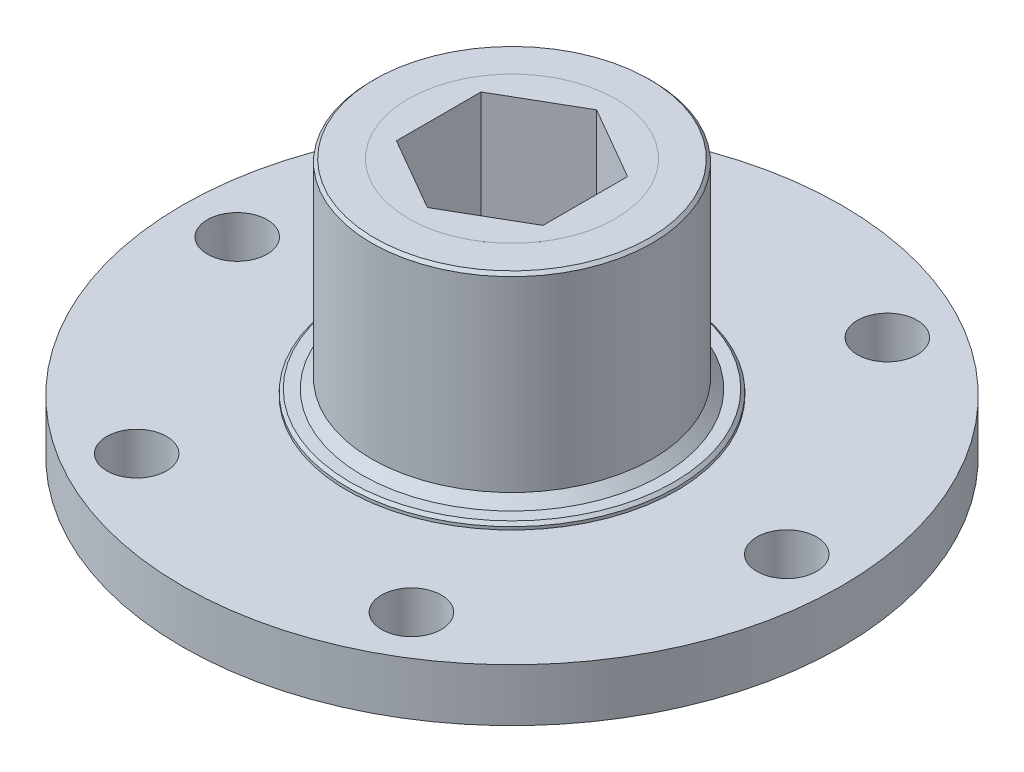
ISO-10303-21;
HEADER;
FILE_DESCRIPTION(('STEP AP214'),'2;1');
FILE_NAME('part.step','',(''),(''),'','','');
FILE_SCHEMA(('AUTOMOTIVE_DESIGN { 1 0 10303 214 1 1 1 1 }'));
ENDSEC;
DATA;
#1=APPLICATION_CONTEXT('core data for automotive mechanical design processes');
#2=APPLICATION_PROTOCOL_DEFINITION('international standard','automotive_design',2000,#1);
#3=PRODUCT_CONTEXT('',#1,'mechanical');
#4=PRODUCT('Part','Part','',(#3));
#5=PRODUCT_RELATED_PRODUCT_CATEGORY('part','',(#4));
#6=PRODUCT_DEFINITION_FORMATION('','',#4);
#7=PRODUCT_DEFINITION_CONTEXT('part definition',#1,'design');
#8=PRODUCT_DEFINITION('design','',#6,#7);
#9=PRODUCT_DEFINITION_SHAPE('','',#8);
#10=(LENGTH_UNIT() NAMED_UNIT(*) SI_UNIT(.MILLI.,.METRE.));
#11=(NAMED_UNIT(*) PLANE_ANGLE_UNIT() SI_UNIT($,.RADIAN.));
#12=(NAMED_UNIT(*) SI_UNIT($,.STERADIAN.) SOLID_ANGLE_UNIT());
#13=UNCERTAINTY_MEASURE_WITH_UNIT(LENGTH_MEASURE(1.E-05),#10,'distance_accuracy_value','');
#14=(GEOMETRIC_REPRESENTATION_CONTEXT(3) GLOBAL_UNCERTAINTY_ASSIGNED_CONTEXT((#13)) GLOBAL_UNIT_ASSIGNED_CONTEXT((#10,
#11,#12)) REPRESENTATION_CONTEXT('',''));
#15=CARTESIAN_POINT('',(0.,0.,0.));
#16=DIRECTION('',(0.,0.,1.));
#17=DIRECTION('',(1.,0.,0.));
#18=AXIS2_PLACEMENT_3D('',#15,#16,#17);
#19=CARTESIAN_POINT('',(0.,0.,0.));
#20=DIRECTION('',(0.,1.,0.));
#21=DIRECTION('',(0.,0.,1.));
#22=AXIS2_PLACEMENT_3D('',#19,#20,#21);
#23=PLANE('',#22);
#24=DIRECTION('',(-0.86602540378444,0.,-0.499999999999998));
#25=VECTOR('',#24,1.);
#26=CARTESIAN_POINT('',(0.,0.,-7.33234841870823));
#27=LINE('',#26,#25);
#28=CARTESIAN_POINT('',(6.35,0.,-3.66617420935412));
#29=VERTEX_POINT('',#28);
#30=CARTESIAN_POINT('',(0.,0.,-7.33234841870823));
#31=VERTEX_POINT('',#30);
#32=EDGE_CURVE('E95',#29,#31,#27,.T.);
#33=ORIENTED_EDGE('',*,*,#32,.T.);
#34=DIRECTION('',(-0.86602540378444,0.,0.499999999999998));
#35=VECTOR('',#34,1.);
#36=CARTESIAN_POINT('',(-6.35,0.,-3.66617420935412));
#37=LINE('',#36,#35);
#38=CARTESIAN_POINT('',(-6.35,0.,-3.66617420935412));
#39=VERTEX_POINT('',#38);
#40=EDGE_CURVE('E89',#31,#39,#37,.T.);
#41=ORIENTED_EDGE('',*,*,#40,.T.);
#42=DIRECTION('',(0.,0.,1.));
#43=VECTOR('',#42,1.);
#44=CARTESIAN_POINT('',(-6.35,0.,-3.66617420935412));
#45=LINE('',#44,#43);
#46=CARTESIAN_POINT('',(-6.35,0.,3.66617420935412));
#47=VERTEX_POINT('',#46);
#48=EDGE_CURVE('E98',#39,#47,#45,.T.);
#49=ORIENTED_EDGE('',*,*,#48,.T.);
#50=DIRECTION('',(0.86602540378444,0.,0.499999999999998));
#51=VECTOR('',#50,1.);
#52=CARTESIAN_POINT('',(0.,0.,7.33234841870823));
#53=LINE('',#52,#51);
#54=CARTESIAN_POINT('',(0.,0.,7.33234841870823));
#55=VERTEX_POINT('',#54);
#56=EDGE_CURVE('E49',#47,#55,#53,.T.);
#57=ORIENTED_EDGE('',*,*,#56,.T.);
#58=DIRECTION('',(0.86602540378444,0.,-0.499999999999998));
#59=VECTOR('',#58,1.);
#60=CARTESIAN_POINT('',(6.35,0.,3.66617420935412));
#61=LINE('',#60,#59);
#62=CARTESIAN_POINT('',(6.35,0.,3.66617420935412));
#63=VERTEX_POINT('',#62);
#64=EDGE_CURVE('E112',#55,#63,#61,.T.);
#65=ORIENTED_EDGE('',*,*,#64,.T.);
#66=DIRECTION('',(0.,0.,-1.));
#67=VECTOR('',#66,1.);
#68=CARTESIAN_POINT('',(6.35,0.,-3.66617420935412));
#69=LINE('',#68,#67);
#70=EDGE_CURVE('E115',#63,#29,#69,.T.);
#71=ORIENTED_EDGE('',*,*,#70,.T.);
#72=EDGE_LOOP('',(#33,#41,#49,#57,#65,#71));
#73=FACE_BOUND('',#72,.T.);
#74=CARTESIAN_POINT('',(0.,0.,0.));
#75=DIRECTION('',(0.,1.,0.));
#76=DIRECTION('',(0.,0.,1.));
#77=AXIS2_PLACEMENT_3D('',#74,#75,#76);
#78=CIRCLE('',#77,8.98423544024529);
#79=CARTESIAN_POINT('',(0.,0.,8.98423544024529));
#80=VERTEX_POINT('',#79);
#81=EDGE_CURVE('E185',#80,#80,#78,.T.);
#82=ORIENTED_EDGE('',*,*,#81,.F.);
#83=EDGE_LOOP('',(#82));
#84=FACE_BOUND('',#83,.T.);
#85=ADVANCED_FACE('F35',(#73,#84),#23,.F.);
#86=CARTESIAN_POINT('',(0.,0.254000000000011,0.));
#87=DIRECTION('',(0.,1.,0.));
#88=DIRECTION('',(0.,0.,1.));
#89=AXIS2_PLACEMENT_3D('',#86,#87,#88);
#90=CONICAL_SURFACE('',#89,9.2382354402453,0.785398163397459);
#91=CARTESIAN_POINT('',(0.,0.254000000000011,0.));
#92=DIRECTION('',(0.,1.,0.));
#93=DIRECTION('',(0.,0.,1.));
#94=AXIS2_PLACEMENT_3D('',#91,#92,#93);
#95=CIRCLE('',#94,9.2382354402453);
#96=CARTESIAN_POINT('',(0.,0.254000000000011,9.2382354402453));
#97=VERTEX_POINT('',#96);
#98=EDGE_CURVE('E181',#97,#97,#95,.T.);
#99=ORIENTED_EDGE('',*,*,#98,.F.);
#100=EDGE_LOOP('',(#99));
#101=FACE_BOUND('',#100,.T.);
#102=ORIENTED_EDGE('',*,*,#81,.T.);
#103=EDGE_LOOP('',(#102));
#104=FACE_BOUND('',#103,.T.);
#105=ADVANCED_FACE('F336',(#101,#104),#90,.T.);
#106=CARTESIAN_POINT('',(0.,-26.1296757039814,0.));
#107=DIRECTION('',(0.,1.,0.));
#108=DIRECTION('',(0.,0.,1.));
#109=AXIS2_PLACEMENT_3D('',#106,#107,#108);
#110=CYLINDRICAL_SURFACE('',#109,9.2382354402453);
#111=CARTESIAN_POINT('',(0.,1.524,0.));
#112=DIRECTION('',(0.,1.,0.));
#113=DIRECTION('',(0.,0.,1.));
#114=AXIS2_PLACEMENT_3D('',#111,#112,#113);
#115=CIRCLE('',#114,9.2382354402453);
#116=CARTESIAN_POINT('',(0.,1.524,9.2382354402453));
#117=VERTEX_POINT('',#116);
#118=EDGE_CURVE('E180',#117,#117,#115,.T.);
#119=ORIENTED_EDGE('',*,*,#118,.F.);
#120=EDGE_LOOP('',(#119));
#121=FACE_BOUND('',#120,.T.);
#122=ORIENTED_EDGE('',*,*,#98,.T.);
#123=EDGE_LOOP('',(#122));
#124=FACE_BOUND('',#123,.T.);
#125=ADVANCED_FACE('F329',(#121,#124),#110,.T.);
#126=CARTESIAN_POINT('',(-8.89,1.524,0.));
#127=DIRECTION('',(0.,-1.,0.));
#128=DIRECTION('',(0.,0.,-1.));
#129=AXIS2_PLACEMENT_3D('',#126,#127,#128);
#130=PLANE('',#129);
#131=CARTESIAN_POINT('',(0.,1.524,0.));
#132=DIRECTION('',(0.,1.,0.));
#133=DIRECTION('',(0.,0.,1.));
#134=AXIS2_PLACEMENT_3D('',#131,#132,#133);
#135=CIRCLE('',#134,14.0208);
#136=CARTESIAN_POINT('',(0.,1.524,14.0208));
#137=VERTEX_POINT('',#136);
#138=EDGE_CURVE('E176',#137,#137,#135,.T.);
#139=ORIENTED_EDGE('',*,*,#138,.F.);
#140=EDGE_LOOP('',(#139));
#141=FACE_BOUND('',#140,.T.);
#142=ORIENTED_EDGE('',*,*,#118,.T.);
#143=EDGE_LOOP('',(#142));
#144=FACE_BOUND('',#143,.T.);
#145=ADVANCED_FACE('F321',(#141,#144),#130,.T.);
#146=CARTESIAN_POINT('',(0.,1.77800000000001,0.));
#147=DIRECTION('',(0.,1.,0.));
#148=DIRECTION('',(0.,0.,1.));
#149=AXIS2_PLACEMENT_3D('',#146,#147,#148);
#150=CONICAL_SURFACE('',#149,14.2748,0.785398163397456);
#151=ORIENTED_EDGE('',*,*,#138,.T.);
#152=EDGE_LOOP('',(#151));
#153=FACE_BOUND('',#152,.T.);
#154=CARTESIAN_POINT('',(0.,1.77800000000001,0.));
#155=DIRECTION('',(0.,-1.,0.));
#156=DIRECTION('',(0.,0.,-1.));
#157=AXIS2_PLACEMENT_3D('',#154,#155,#156);
#158=CIRCLE('',#157,14.2748);
#159=CARTESIAN_POINT('',(0.,1.77800000000001,-14.2748));
#160=VERTEX_POINT('',#159);
#161=EDGE_CURVE('E169',#160,#160,#158,.F.);
#162=ORIENTED_EDGE('',*,*,#161,.F.);
#163=EDGE_LOOP('',(#162));
#164=FACE_BOUND('',#163,.T.);
#165=ADVANCED_FACE('F263',(#153,#164),#150,.T.);
#166=CARTESIAN_POINT('',(0.,-1.0757851457721,0.));
#167=DIRECTION('',(0.,-1.,0.));
#168=DIRECTION('',(0.,0.,-1.));
#169=AXIS2_PLACEMENT_3D('',#166,#167,#168);
#170=CYLINDRICAL_SURFACE('',#169,14.2748);
#171=CARTESIAN_POINT('',(0.,3.048,0.));
#172=DIRECTION('',(0.,-1.,0.));
#173=DIRECTION('',(0.,0.,-1.));
#174=AXIS2_PLACEMENT_3D('',#171,#172,#173);
#175=CIRCLE('',#174,14.2748);
#176=CARTESIAN_POINT('',(0.,3.048,-14.2748));
#177=VERTEX_POINT('',#176);
#178=EDGE_CURVE('E206',#177,#177,#175,.F.);
#179=ORIENTED_EDGE('',*,*,#178,.F.);
#180=EDGE_LOOP('',(#179));
#181=FACE_BOUND('',#180,.T.);
#182=ORIENTED_EDGE('',*,*,#161,.T.);
#183=EDGE_LOOP('',(#182));
#184=FACE_BOUND('',#183,.T.);
#185=ADVANCED_FACE('F252',(#181,#184),#170,.T.);
#186=CARTESIAN_POINT('',(-38.1,3.048,0.));
#187=DIRECTION('',(0.,-1.,0.));
#188=DIRECTION('',(0.,0.,-1.));
#189=AXIS2_PLACEMENT_3D('',#186,#187,#188);
#190=PLANE('',#189);
#191=CARTESIAN_POINT('',(-11.9062499999998,3.048,20.6222299276171));
#192=DIRECTION('',(0.,1.,0.));
#193=DIRECTION('',(0.,0.,1.));
#194=AXIS2_PLACEMENT_3D('',#191,#192,#193);
#195=CIRCLE('',#194,2.5908);
#196=CARTESIAN_POINT('',(-11.9062499999998,3.048,23.2130299276171));
#197=VERTEX_POINT('',#196);
#198=EDGE_CURVE('E200',#197,#197,#195,.T.);
#199=ORIENTED_EDGE('',*,*,#198,.T.);
#200=EDGE_LOOP('',(#199));
#201=FACE_BOUND('',#200,.T.);
#202=CARTESIAN_POINT('',(11.9062500000002,3.048,20.6222299276168));
#203=DIRECTION('',(0.,1.,0.));
#204=DIRECTION('',(0.,0.,1.));
#205=AXIS2_PLACEMENT_3D('',#202,#203,#204);
#206=CIRCLE('',#205,2.5908);
#207=CARTESIAN_POINT('',(11.9062500000002,3.048,23.2130299276168));
#208=VERTEX_POINT('',#207);
#209=EDGE_CURVE('E197',#208,#208,#206,.T.);
#210=ORIENTED_EDGE('',*,*,#209,.T.);
#211=EDGE_LOOP('',(#210));
#212=FACE_BOUND('',#211,.T.);
#213=CARTESIAN_POINT('',(23.8125,3.048,0.));
#214=DIRECTION('',(0.,1.,0.));
#215=DIRECTION('',(0.,0.,1.));
#216=AXIS2_PLACEMENT_3D('',#213,#214,#215);
#217=CIRCLE('',#216,2.5908);
#218=CARTESIAN_POINT('',(23.8125,3.048,2.5908));
#219=VERTEX_POINT('',#218);
#220=EDGE_CURVE('E194',#219,#219,#217,.T.);
#221=ORIENTED_EDGE('',*,*,#220,.T.);
#222=EDGE_LOOP('',(#221));
#223=FACE_BOUND('',#222,.T.);
#224=CARTESIAN_POINT('',(11.90625,3.048,-20.622229927617));
#225=DIRECTION('',(0.,1.,0.));
#226=DIRECTION('',(0.,0.,1.));
#227=AXIS2_PLACEMENT_3D('',#224,#225,#226);
#228=CIRCLE('',#227,2.5908);
#229=CARTESIAN_POINT('',(11.90625,3.048,-18.031429927617));
#230=VERTEX_POINT('',#229);
#231=EDGE_CURVE('E191',#230,#230,#228,.T.);
#232=ORIENTED_EDGE('',*,*,#231,.T.);
#233=EDGE_LOOP('',(#232));
#234=FACE_BOUND('',#233,.T.);
#235=CARTESIAN_POINT('',(-11.9062500000001,3.048,-20.6222299276169));
#236=DIRECTION('',(0.,1.,0.));
#237=DIRECTION('',(0.,0.,1.));
#238=AXIS2_PLACEMENT_3D('',#235,#236,#237);
#239=CIRCLE('',#238,2.5908);
#240=CARTESIAN_POINT('',(-11.9062500000001,3.048,-18.0314299276169));
#241=VERTEX_POINT('',#240);
#242=EDGE_CURVE('E188',#241,#241,#239,.T.);
#243=ORIENTED_EDGE('',*,*,#242,.T.);
#244=EDGE_LOOP('',(#243));
#245=FACE_BOUND('',#244,.T.);
#246=CARTESIAN_POINT('',(-23.8125,3.048,0.));
#247=DIRECTION('',(0.,1.,0.));
#248=DIRECTION('',(0.,0.,1.));
#249=AXIS2_PLACEMENT_3D('',#246,#247,#248);
#250=CIRCLE('',#249,2.5908);
#251=CARTESIAN_POINT('',(-23.8125,3.048,2.5908));
#252=VERTEX_POINT('',#251);
#253=EDGE_CURVE('E168',#252,#252,#250,.T.);
#254=ORIENTED_EDGE('',*,*,#253,.T.);
#255=EDGE_LOOP('',(#254));
#256=FACE_BOUND('',#255,.T.);
#257=ORIENTED_EDGE('',*,*,#178,.T.);
#258=EDGE_LOOP('',(#257));
#259=FACE_BOUND('',#258,.T.);
#260=CARTESIAN_POINT('',(0.,3.048,0.));
#261=DIRECTION('',(0.,-1.,0.));
#262=DIRECTION('',(0.,0.,-1.));
#263=AXIS2_PLACEMENT_3D('',#260,#261,#262);
#264=CIRCLE('',#263,28.575);
#265=CARTESIAN_POINT('',(0.,3.048,-28.575));
#266=VERTEX_POINT('',#265);
#267=EDGE_CURVE('E159',#266,#266,#264,.T.);
#268=ORIENTED_EDGE('',*,*,#267,.T.);
#269=EDGE_LOOP('',(#268));
#270=FACE_BOUND('',#269,.T.);
#271=ADVANCED_FACE('F249',(#201,#212,#223,#234,#245,#256,#259,#270),#190,.T.);
#272=CARTESIAN_POINT('',(-11.9062499999998,0.,20.6222299276171));
#273=DIRECTION('',(0.,1.,0.));
#274=DIRECTION('',(0.,0.,1.));
#275=AXIS2_PLACEMENT_3D('',#272,#273,#274);
#276=CYLINDRICAL_SURFACE('',#275,2.5908);
#277=ORIENTED_EDGE('',*,*,#198,.F.);
#278=EDGE_LOOP('',(#277));
#279=FACE_BOUND('',#278,.T.);
#280=CARTESIAN_POINT('',(-11.9062499999998,7.62,20.6222299276171));
#281=DIRECTION('',(0.,-1.,0.));
#282=DIRECTION('',(0.,0.,-1.));
#283=AXIS2_PLACEMENT_3D('',#280,#281,#282);
#284=CIRCLE('',#283,2.5908);
#285=CARTESIAN_POINT('',(-11.9062499999998,7.62,18.0314299276171));
#286=VERTEX_POINT('',#285);
#287=EDGE_CURVE('E156',#286,#286,#284,.T.);
#288=ORIENTED_EDGE('',*,*,#287,.F.);
#289=EDGE_LOOP('',(#288));
#290=FACE_BOUND('',#289,.T.);
#291=ADVANCED_FACE('F251',(#279,#290),#276,.F.);
#292=CARTESIAN_POINT('',(11.9062500000002,0.,20.6222299276168));
#293=DIRECTION('',(0.,1.,0.));
#294=DIRECTION('',(0.,0.,1.));
#295=AXIS2_PLACEMENT_3D('',#292,#293,#294);
#296=CYLINDRICAL_SURFACE('',#295,2.5908);
#297=ORIENTED_EDGE('',*,*,#209,.F.);
#298=EDGE_LOOP('',(#297));
#299=FACE_BOUND('',#298,.T.);
#300=CARTESIAN_POINT('',(11.9062500000002,7.62,20.6222299276168));
#301=DIRECTION('',(0.,-1.,0.));
#302=DIRECTION('',(0.,0.,-1.));
#303=AXIS2_PLACEMENT_3D('',#300,#301,#302);
#304=CIRCLE('',#303,2.5908);
#305=CARTESIAN_POINT('',(11.9062500000002,7.62,18.0314299276168));
#306=VERTEX_POINT('',#305);
#307=EDGE_CURVE('E153',#306,#306,#304,.T.);
#308=ORIENTED_EDGE('',*,*,#307,.F.);
#309=EDGE_LOOP('',(#308));
#310=FACE_BOUND('',#309,.T.);
#311=ADVANCED_FACE('F259',(#299,#310),#296,.F.);
#312=CARTESIAN_POINT('',(23.8125,0.,0.));
#313=DIRECTION('',(0.,1.,0.));
#314=DIRECTION('',(0.,0.,1.));
#315=AXIS2_PLACEMENT_3D('',#312,#313,#314);
#316=CYLINDRICAL_SURFACE('',#315,2.5908);
#317=ORIENTED_EDGE('',*,*,#220,.F.);
#318=EDGE_LOOP('',(#317));
#319=FACE_BOUND('',#318,.T.);
#320=CARTESIAN_POINT('',(23.8125,7.62,0.));
#321=DIRECTION('',(0.,-1.,0.));
#322=DIRECTION('',(0.,0.,-1.));
#323=AXIS2_PLACEMENT_3D('',#320,#321,#322);
#324=CIRCLE('',#323,2.5908);
#325=CARTESIAN_POINT('',(23.8125,7.62,-2.5908));
#326=VERTEX_POINT('',#325);
#327=EDGE_CURVE('E150',#326,#326,#324,.T.);
#328=ORIENTED_EDGE('',*,*,#327,.F.);
#329=EDGE_LOOP('',(#328));
#330=FACE_BOUND('',#329,.T.);
#331=ADVANCED_FACE('F285',(#319,#330),#316,.F.);
#332=CARTESIAN_POINT('',(11.90625,0.,-20.622229927617));
#333=DIRECTION('',(0.,1.,0.));
#334=DIRECTION('',(0.,0.,1.));
#335=AXIS2_PLACEMENT_3D('',#332,#333,#334);
#336=CYLINDRICAL_SURFACE('',#335,2.5908);
#337=ORIENTED_EDGE('',*,*,#231,.F.);
#338=EDGE_LOOP('',(#337));
#339=FACE_BOUND('',#338,.T.);
#340=CARTESIAN_POINT('',(11.90625,7.62,-20.622229927617));
#341=DIRECTION('',(0.,-1.,0.));
#342=DIRECTION('',(0.,0.,-1.));
#343=AXIS2_PLACEMENT_3D('',#340,#341,#342);
#344=CIRCLE('',#343,2.5908);
#345=CARTESIAN_POINT('',(11.90625,7.62,-23.213029927617));
#346=VERTEX_POINT('',#345);
#347=EDGE_CURVE('E147',#346,#346,#344,.T.);
#348=ORIENTED_EDGE('',*,*,#347,.F.);
#349=EDGE_LOOP('',(#348));
#350=FACE_BOUND('',#349,.T.);
#351=ADVANCED_FACE('F276',(#339,#350),#336,.F.);
#352=CARTESIAN_POINT('',(-11.9062500000001,0.,-20.6222299276169));
#353=DIRECTION('',(0.,1.,0.));
#354=DIRECTION('',(0.,0.,1.));
#355=AXIS2_PLACEMENT_3D('',#352,#353,#354);
#356=CYLINDRICAL_SURFACE('',#355,2.5908);
#357=ORIENTED_EDGE('',*,*,#242,.F.);
#358=EDGE_LOOP('',(#357));
#359=FACE_BOUND('',#358,.T.);
#360=CARTESIAN_POINT('',(-11.90625,7.62,-20.622229927617));
#361=DIRECTION('',(0.,-1.,0.));
#362=DIRECTION('',(0.,0.,-1.));
#363=AXIS2_PLACEMENT_3D('',#360,#361,#362);
#364=CIRCLE('',#363,2.59079999999991);
#365=CARTESIAN_POINT('',(-11.90625,7.62,-23.2130299276169));
#366=VERTEX_POINT('',#365);
#367=EDGE_CURVE('E144',#366,#366,#364,.T.);
#368=ORIENTED_EDGE('',*,*,#367,.F.);
#369=EDGE_LOOP('',(#368));
#370=FACE_BOUND('',#369,.T.);
#371=ADVANCED_FACE('F270',(#359,#370),#356,.F.);
#372=CARTESIAN_POINT('',(-23.8125,0.,0.));
#373=DIRECTION('',(0.,1.,0.));
#374=DIRECTION('',(0.,0.,1.));
#375=AXIS2_PLACEMENT_3D('',#372,#373,#374);
#376=CYLINDRICAL_SURFACE('',#375,2.5908);
#377=ORIENTED_EDGE('',*,*,#253,.F.);
#378=EDGE_LOOP('',(#377));
#379=FACE_BOUND('',#378,.T.);
#380=CARTESIAN_POINT('',(-23.8125,7.62,0.));
#381=DIRECTION('',(0.,-1.,0.));
#382=DIRECTION('',(0.,0.,-1.));
#383=AXIS2_PLACEMENT_3D('',#380,#381,#382);
#384=CIRCLE('',#383,2.59080000000001);
#385=CARTESIAN_POINT('',(-23.8125,7.62,-2.59080000000001));
#386=VERTEX_POINT('',#385);
#387=EDGE_CURVE('E141',#386,#386,#384,.T.);
#388=ORIENTED_EDGE('',*,*,#387,.F.);
#389=EDGE_LOOP('',(#388));
#390=FACE_BOUND('',#389,.T.);
#391=ADVANCED_FACE('F227',(#379,#390),#376,.F.);
#392=CARTESIAN_POINT('',(0.,7.62,0.));
#393=DIRECTION('',(0.,-1.,0.));
#394=DIRECTION('',(0.,0.,-1.));
#395=AXIS2_PLACEMENT_3D('',#392,#393,#394);
#396=PLANE('',#395);
#397=CARTESIAN_POINT('',(0.,7.62,0.));
#398=DIRECTION('',(0.,-1.,0.));
#399=DIRECTION('',(0.,0.,-1.));
#400=AXIS2_PLACEMENT_3D('',#397,#398,#399);
#401=CIRCLE('',#400,14.2748);
#402=CARTESIAN_POINT('',(0.,7.62,-14.2748));
#403=VERTEX_POINT('',#402);
#404=EDGE_CURVE('E163',#403,#403,#401,.F.);
#405=ORIENTED_EDGE('',*,*,#404,.F.);
#406=EDGE_LOOP('',(#405));
#407=FACE_BOUND('',#406,.T.);
#408=ORIENTED_EDGE('',*,*,#387,.T.);
#409=EDGE_LOOP('',(#408));
#410=FACE_BOUND('',#409,.T.);
#411=ORIENTED_EDGE('',*,*,#367,.T.);
#412=EDGE_LOOP('',(#411));
#413=FACE_BOUND('',#412,.T.);
#414=ORIENTED_EDGE('',*,*,#347,.T.);
#415=EDGE_LOOP('',(#414));
#416=FACE_BOUND('',#415,.T.);
#417=ORIENTED_EDGE('',*,*,#327,.T.);
#418=EDGE_LOOP('',(#417));
#419=FACE_BOUND('',#418,.T.);
#420=ORIENTED_EDGE('',*,*,#307,.T.);
#421=EDGE_LOOP('',(#420));
#422=FACE_BOUND('',#421,.T.);
#423=ORIENTED_EDGE('',*,*,#287,.T.);
#424=EDGE_LOOP('',(#423));
#425=FACE_BOUND('',#424,.T.);
#426=CARTESIAN_POINT('',(0.,7.62,0.));
#427=DIRECTION('',(0.,-1.,0.));
#428=DIRECTION('',(0.,0.,-1.));
#429=AXIS2_PLACEMENT_3D('',#426,#427,#428);
#430=CIRCLE('',#429,28.575);
#431=CARTESIAN_POINT('',(0.,7.62,-28.575));
#432=VERTEX_POINT('',#431);
#433=EDGE_CURVE('E160',#432,#432,#430,.T.);
#434=ORIENTED_EDGE('',*,*,#433,.F.);
#435=EDGE_LOOP('',(#434));
#436=FACE_BOUND('',#435,.T.);
#437=ADVANCED_FACE('F223',(#407,#410,#413,#416,#419,#422,#425,#436),#396,.F.);
#438=CARTESIAN_POINT('',(0.,7.62,0.));
#439=DIRECTION('',(0.,-1.,0.));
#440=DIRECTION('',(0.,0.,-1.));
#441=AXIS2_PLACEMENT_3D('',#438,#439,#440);
#442=CYLINDRICAL_SURFACE('',#441,28.575);
#443=ORIENTED_EDGE('',*,*,#433,.T.);
#444=EDGE_LOOP('',(#443));
#445=FACE_BOUND('',#444,.T.);
#446=ORIENTED_EDGE('',*,*,#267,.F.);
#447=EDGE_LOOP('',(#446));
#448=FACE_BOUND('',#447,.T.);
#449=ADVANCED_FACE('F226',(#445,#448),#442,.T.);
#450=CARTESIAN_POINT('',(0.,25.146,0.));
#451=DIRECTION('',(0.,-1.,0.));
#452=DIRECTION('',(1.,0.,0.));
#453=AXIS2_PLACEMENT_3D('',#450,#451,#452);
#454=CONICAL_SURFACE('',#453,12.1666,0.785398163397452);
#455=CARTESIAN_POINT('',(0.,25.4,0.));
#456=DIRECTION('',(0.,-1.,0.));
#457=DIRECTION('',(1.,0.,0.));
#458=AXIS2_PLACEMENT_3D('',#455,#456,#457);
#459=CIRCLE('',#458,11.9126);
#460=CARTESIAN_POINT('',(11.9126,25.4,0.));
#461=VERTEX_POINT('',#460);
#462=EDGE_CURVE('E184',#461,#461,#459,.T.);
#463=ORIENTED_EDGE('',*,*,#462,.T.);
#464=EDGE_LOOP('',(#463));
#465=FACE_BOUND('',#464,.T.);
#466=CARTESIAN_POINT('',(0.,25.146,0.));
#467=DIRECTION('',(0.,-1.,0.));
#468=DIRECTION('',(0.,0.,-1.));
#469=AXIS2_PLACEMENT_3D('',#466,#467,#468);
#470=CIRCLE('',#469,12.1666);
#471=CARTESIAN_POINT('',(0.,25.146,-12.1666));
#472=VERTEX_POINT('',#471);
#473=EDGE_CURVE('E177',#472,#472,#470,.T.);
#474=ORIENTED_EDGE('',*,*,#473,.F.);
#475=EDGE_LOOP('',(#474));
#476=FACE_BOUND('',#475,.T.);
#477=ADVANCED_FACE('F245',(#465,#476),#454,.T.);
#478=CARTESIAN_POINT('',(0.,25.4,0.));
#479=DIRECTION('',(0.,1.,0.));
#480=DIRECTION('',(0.,0.,1.));
#481=AXIS2_PLACEMENT_3D('',#478,#479,#480);
#482=PLANE('',#481);
#483=CARTESIAN_POINT('',(0.,25.4,0.));
#484=DIRECTION('',(0.,1.,0.));
#485=DIRECTION('',(0.,0.,1.));
#486=AXIS2_PLACEMENT_3D('',#483,#484,#485);
#487=CIRCLE('',#486,8.98423544024529);
#488=CARTESIAN_POINT('',(0.,25.4,8.98423544024529));
#489=VERTEX_POINT('',#488);
#490=EDGE_CURVE('E11',#489,#489,#487,.T.);
#491=ORIENTED_EDGE('',*,*,#490,.F.);
#492=EDGE_LOOP('',(#491));
#493=FACE_BOUND('',#492,.T.);
#494=ORIENTED_EDGE('',*,*,#462,.F.);
#495=EDGE_LOOP('',(#494));
#496=FACE_BOUND('',#495,.T.);
#497=ADVANCED_FACE('F325',(#493,#496),#482,.T.);
#498=CARTESIAN_POINT('',(0.,25.4,0.));
#499=DIRECTION('',(0.,-1.,0.));
#500=DIRECTION('',(0.,0.,-1.));
#501=AXIS2_PLACEMENT_3D('',#498,#499,#500);
#502=CYLINDRICAL_SURFACE('',#501,12.1666);
#503=ORIENTED_EDGE('',*,*,#473,.T.);
#504=EDGE_LOOP('',(#503));
#505=FACE_BOUND('',#504,.T.);
#506=CARTESIAN_POINT('',(0.,8.94079999999999,0.));
#507=DIRECTION('',(0.,-1.,0.));
#508=DIRECTION('',(0.,0.,-1.));
#509=AXIS2_PLACEMENT_3D('',#506,#507,#508);
#510=CIRCLE('',#509,12.1666);
#511=CARTESIAN_POINT('',(0.,8.94079999999999,-12.1666));
#512=VERTEX_POINT('',#511);
#513=EDGE_CURVE('E173',#512,#512,#510,.T.);
#514=ORIENTED_EDGE('',*,*,#513,.F.);
#515=EDGE_LOOP('',(#514));
#516=FACE_BOUND('',#515,.T.);
#517=ADVANCED_FACE('F315',(#505,#516),#502,.T.);
#518=CARTESIAN_POINT('',(0.,8.128,0.));
#519=DIRECTION('',(0.,-1.,0.));
#520=DIRECTION('',(0.,0.,-1.));
#521=AXIS2_PLACEMENT_3D('',#518,#519,#520);
#522=CONICAL_SURFACE('',#521,12.9794,0.785398163397449);
#523=ORIENTED_EDGE('',*,*,#513,.T.);
#524=EDGE_LOOP('',(#523));
#525=FACE_BOUND('',#524,.T.);
#526=CARTESIAN_POINT('',(0.,8.128,0.));
#527=DIRECTION('',(0.,-1.,0.));
#528=DIRECTION('',(0.,0.,-1.));
#529=AXIS2_PLACEMENT_3D('',#526,#527,#528);
#530=CIRCLE('',#529,12.9794);
#531=CARTESIAN_POINT('',(0.,8.128,-12.9794));
#532=VERTEX_POINT('',#531);
#533=EDGE_CURVE('E172',#532,#532,#530,.T.);
#534=ORIENTED_EDGE('',*,*,#533,.F.);
#535=EDGE_LOOP('',(#534));
#536=FACE_BOUND('',#535,.T.);
#537=ADVANCED_FACE('F305',(#525,#536),#522,.T.);
#538=CARTESIAN_POINT('',(0.,8.128,0.));
#539=DIRECTION('',(0.,1.,0.));
#540=DIRECTION('',(0.,0.,1.));
#541=AXIS2_PLACEMENT_3D('',#538,#539,#540);
#542=PLANE('',#541);
#543=ORIENTED_EDGE('',*,*,#533,.T.);
#544=EDGE_LOOP('',(#543));
#545=FACE_BOUND('',#544,.T.);
#546=CARTESIAN_POINT('',(0.,8.128,0.));
#547=DIRECTION('',(0.,-1.,0.));
#548=DIRECTION('',(1.,0.,0.));
#549=AXIS2_PLACEMENT_3D('',#546,#547,#548);
#550=CIRCLE('',#549,14.0208);
#551=CARTESIAN_POINT('',(14.0208,8.128,0.));
#552=VERTEX_POINT('',#551);
#553=EDGE_CURVE('E203',#552,#552,#550,.T.);
#554=ORIENTED_EDGE('',*,*,#553,.F.);
#555=EDGE_LOOP('',(#554));
#556=FACE_BOUND('',#555,.T.);
#557=ADVANCED_FACE('F294',(#545,#556),#542,.T.);
#558=CARTESIAN_POINT('',(0.,7.87399999999998,0.));
#559=DIRECTION('',(0.,-1.,0.));
#560=DIRECTION('',(1.,0.,0.));
#561=AXIS2_PLACEMENT_3D('',#558,#559,#560);
#562=CONICAL_SURFACE('',#561,14.2748,0.785398163397455);
#563=ORIENTED_EDGE('',*,*,#553,.T.);
#564=EDGE_LOOP('',(#563));
#565=FACE_BOUND('',#564,.T.);
#566=CARTESIAN_POINT('',(0.,7.87399999999998,0.));
#567=DIRECTION('',(0.,-1.,0.));
#568=DIRECTION('',(0.,0.,-1.));
#569=AXIS2_PLACEMENT_3D('',#566,#567,#568);
#570=CIRCLE('',#569,14.2748);
#571=CARTESIAN_POINT('',(0.,7.87399999999998,-14.2748));
#572=VERTEX_POINT('',#571);
#573=EDGE_CURVE('E42',#572,#572,#570,.T.);
#574=ORIENTED_EDGE('',*,*,#573,.F.);
#575=EDGE_LOOP('',(#574));
#576=FACE_BOUND('',#575,.T.);
#577=ADVANCED_FACE('F292',(#565,#576),#562,.T.);
#578=CARTESIAN_POINT('',(0.,-1.0757851457721,0.));
#579=DIRECTION('',(0.,-1.,0.));
#580=DIRECTION('',(0.,0.,-1.));
#581=AXIS2_PLACEMENT_3D('',#578,#579,#580);
#582=CYLINDRICAL_SURFACE('',#581,14.2748);
#583=ORIENTED_EDGE('',*,*,#573,.T.);
#584=EDGE_LOOP('',(#583));
#585=FACE_BOUND('',#584,.T.);
#586=ORIENTED_EDGE('',*,*,#404,.T.);
#587=EDGE_LOOP('',(#586));
#588=FACE_BOUND('',#587,.T.);
#589=ADVANCED_FACE('F221',(#585,#588),#582,.T.);
#590=CARTESIAN_POINT('',(0.,25.4001030776407,0.));
#591=DIRECTION('',(0.,-1.,0.));
#592=DIRECTION('',(0.,0.,-1.));
#593=AXIS2_PLACEMENT_3D('',#590,#591,#592);
#594=PLANE('',#593);
#595=DIRECTION('',(0.,0.,1.));
#596=VECTOR('',#595,1.);
#597=CARTESIAN_POINT('',(-6.35,25.4001030776407,-3.66617420935412));
#598=LINE('',#597,#596);
#599=CARTESIAN_POINT('',(-6.35,25.4001030776407,-3.66617420935412));
#600=VERTEX_POINT('',#599);
#601=CARTESIAN_POINT('',(-6.35,25.4001030776407,3.66617420935412));
#602=VERTEX_POINT('',#601);
#603=EDGE_CURVE('E119',#600,#602,#598,.T.);
#604=ORIENTED_EDGE('',*,*,#603,.F.);
#605=DIRECTION('',(-0.86602540378444,0.,0.499999999999998));
#606=VECTOR('',#605,1.);
#607=CARTESIAN_POINT('',(-6.35,25.4001030776407,-3.66617420935412));
#608=LINE('',#607,#606);
#609=CARTESIAN_POINT('',(0.,25.4001030776407,-7.33234841870823));
#610=VERTEX_POINT('',#609);
#611=EDGE_CURVE('E57',#610,#600,#608,.T.);
#612=ORIENTED_EDGE('',*,*,#611,.F.);
#613=DIRECTION('',(-0.86602540378444,0.,-0.499999999999998));
#614=VECTOR('',#613,1.);
#615=CARTESIAN_POINT('',(0.,25.4001030776407,-7.33234841870823));
#616=LINE('',#615,#614);
#617=CARTESIAN_POINT('',(6.35,25.4001030776407,-3.66617420935412));
#618=VERTEX_POINT('',#617);
#619=EDGE_CURVE('E105',#618,#610,#616,.T.);
#620=ORIENTED_EDGE('',*,*,#619,.F.);
#621=DIRECTION('',(0.,0.,-1.));
#622=VECTOR('',#621,1.);
#623=CARTESIAN_POINT('',(6.35,25.4001030776407,-3.66617420935412));
#624=LINE('',#623,#622);
#625=CARTESIAN_POINT('',(6.35,25.4001030776407,3.66617420935412));
#626=VERTEX_POINT('',#625);
#627=EDGE_CURVE('E108',#626,#618,#624,.T.);
#628=ORIENTED_EDGE('',*,*,#627,.F.);
#629=DIRECTION('',(0.86602540378444,0.,-0.499999999999998));
#630=VECTOR('',#629,1.);
#631=CARTESIAN_POINT('',(6.35,25.4001030776407,3.66617420935412));
#632=LINE('',#631,#630);
#633=CARTESIAN_POINT('',(0.,25.4001030776407,7.33234841870823));
#634=VERTEX_POINT('',#633);
#635=EDGE_CURVE('E124',#634,#626,#632,.T.);
#636=ORIENTED_EDGE('',*,*,#635,.F.);
#637=DIRECTION('',(0.86602540378444,0.,0.499999999999998));
#638=VECTOR('',#637,1.);
#639=CARTESIAN_POINT('',(0.,25.4001030776407,7.33234841870823));
#640=LINE('',#639,#638);
#641=EDGE_CURVE('E121',#602,#634,#640,.T.);
#642=ORIENTED_EDGE('',*,*,#641,.F.);
#643=EDGE_LOOP('',(#604,#612,#620,#628,#636,#642));
#644=FACE_BOUND('',#643,.T.);
#645=CARTESIAN_POINT('',(0.,25.4001030776407,0.));
#646=DIRECTION('',(0.,-1.,0.));
#647=DIRECTION('',(0.,0.,-1.));
#648=AXIS2_PLACEMENT_3D('',#645,#646,#647);
#649=CIRCLE('',#648,8.98423544024529);
#650=CARTESIAN_POINT('',(0.,25.4001030776407,-8.98423544024529));
#651=VERTEX_POINT('',#650);
#652=EDGE_CURVE('E131',#651,#651,#649,.T.);
#653=ORIENTED_EDGE('',*,*,#652,.F.);
#654=EDGE_LOOP('',(#653));
#655=FACE_BOUND('',#654,.T.);
#656=ADVANCED_FACE('F302',(#644,#655),#594,.F.);
#657=CARTESIAN_POINT('',(0.,25.4001030776407,0.));
#658=DIRECTION('',(0.,-1.,0.));
#659=DIRECTION('',(0.,0.,-1.));
#660=AXIS2_PLACEMENT_3D('',#657,#658,#659);
#661=CYLINDRICAL_SURFACE('',#660,8.98423544024529);
#662=ORIENTED_EDGE('',*,*,#490,.T.);
#663=EDGE_LOOP('',(#662));
#664=FACE_BOUND('',#663,.T.);
#665=ORIENTED_EDGE('',*,*,#652,.T.);
#666=EDGE_LOOP('',(#665));
#667=FACE_BOUND('',#666,.T.);
#668=ADVANCED_FACE('F360',(#664,#667),#661,.T.);
#669=CARTESIAN_POINT('',(-6.35,0.,-3.66617420935412));
#670=DIRECTION('',(-0.499999999999998,0.,-0.86602540378444));
#671=DIRECTION('',(-0.86602540378444,0.,0.499999999999998));
#672=AXIS2_PLACEMENT_3D('',#669,#670,#671);
#673=PLANE('',#672);
#674=ORIENTED_EDGE('',*,*,#611,.T.);
#675=DIRECTION('',(0.,1.,0.));
#676=VECTOR('',#675,1.);
#677=CARTESIAN_POINT('',(-6.35,0.,-3.66617420935412));
#678=LINE('',#677,#676);
#679=EDGE_CURVE('E85',#39,#600,#678,.T.);
#680=ORIENTED_EDGE('',*,*,#679,.F.);
#681=ORIENTED_EDGE('',*,*,#40,.F.);
#682=DIRECTION('',(0.,1.,0.));
#683=VECTOR('',#682,1.);
#684=CARTESIAN_POINT('',(0.,0.,-7.33234841870823));
#685=LINE('',#684,#683);
#686=EDGE_CURVE('E129',#31,#610,#685,.T.);
#687=ORIENTED_EDGE('',*,*,#686,.T.);
#688=EDGE_LOOP('',(#674,#680,#681,#687));
#689=FACE_BOUND('',#688,.T.);
#690=ADVANCED_FACE('F87',(#689),#673,.F.);
#691=CARTESIAN_POINT('',(0.,0.,-7.33234841870823));
#692=DIRECTION('',(0.499999999999998,0.,-0.86602540378444));
#693=DIRECTION('',(-0.86602540378444,0.,-0.499999999999998));
#694=AXIS2_PLACEMENT_3D('',#691,#692,#693);
#695=PLANE('',#694);
#696=ORIENTED_EDGE('',*,*,#619,.T.);
#697=ORIENTED_EDGE('',*,*,#686,.F.);
#698=ORIENTED_EDGE('',*,*,#32,.F.);
#699=DIRECTION('',(0.,1.,0.));
#700=VECTOR('',#699,1.);
#701=CARTESIAN_POINT('',(6.35,0.,-3.66617420935412));
#702=LINE('',#701,#700);
#703=EDGE_CURVE('E132',#29,#618,#702,.T.);
#704=ORIENTED_EDGE('',*,*,#703,.T.);
#705=EDGE_LOOP('',(#696,#697,#698,#704));
#706=FACE_BOUND('',#705,.T.);
#707=ADVANCED_FACE('F371',(#706),#695,.F.);
#708=CARTESIAN_POINT('',(6.35,0.,-3.66617420935412));
#709=DIRECTION('',(1.,0.,0.));
#710=DIRECTION('',(0.,0.,-1.));
#711=AXIS2_PLACEMENT_3D('',#708,#709,#710);
#712=PLANE('',#711);
#713=ORIENTED_EDGE('',*,*,#627,.T.);
#714=ORIENTED_EDGE('',*,*,#703,.F.);
#715=ORIENTED_EDGE('',*,*,#70,.F.);
#716=DIRECTION('',(0.,1.,0.));
#717=VECTOR('',#716,1.);
#718=CARTESIAN_POINT('',(6.35,0.,3.66617420935412));
#719=LINE('',#718,#717);
#720=EDGE_CURVE('E134',#63,#626,#719,.T.);
#721=ORIENTED_EDGE('',*,*,#720,.T.);
#722=EDGE_LOOP('',(#713,#714,#715,#721));
#723=FACE_BOUND('',#722,.T.);
#724=ADVANCED_FACE('F378',(#723),#712,.F.);
#725=CARTESIAN_POINT('',(6.35,0.,3.66617420935412));
#726=DIRECTION('',(0.499999999999998,0.,0.86602540378444));
#727=DIRECTION('',(0.86602540378444,0.,-0.499999999999998));
#728=AXIS2_PLACEMENT_3D('',#725,#726,#727);
#729=PLANE('',#728);
#730=ORIENTED_EDGE('',*,*,#635,.T.);
#731=ORIENTED_EDGE('',*,*,#720,.F.);
#732=ORIENTED_EDGE('',*,*,#64,.F.);
#733=DIRECTION('',(0.,1.,0.));
#734=VECTOR('',#733,1.);
#735=CARTESIAN_POINT('',(0.,0.,7.33234841870823));
#736=LINE('',#735,#734);
#737=EDGE_CURVE('E136',#55,#634,#736,.T.);
#738=ORIENTED_EDGE('',*,*,#737,.T.);
#739=EDGE_LOOP('',(#730,#731,#732,#738));
#740=FACE_BOUND('',#739,.T.);
#741=ADVANCED_FACE('F386',(#740),#729,.F.);
#742=CARTESIAN_POINT('',(0.,0.,7.33234841870823));
#743=DIRECTION('',(-0.499999999999998,0.,0.86602540378444));
#744=DIRECTION('',(0.86602540378444,0.,0.499999999999998));
#745=AXIS2_PLACEMENT_3D('',#742,#743,#744);
#746=PLANE('',#745);
#747=ORIENTED_EDGE('',*,*,#641,.T.);
#748=ORIENTED_EDGE('',*,*,#737,.F.);
#749=ORIENTED_EDGE('',*,*,#56,.F.);
#750=DIRECTION('',(0.,1.,0.));
#751=VECTOR('',#750,1.);
#752=CARTESIAN_POINT('',(-6.35,0.,3.66617420935412));
#753=LINE('',#752,#751);
#754=EDGE_CURVE('E94',#47,#602,#753,.T.);
#755=ORIENTED_EDGE('',*,*,#754,.T.);
#756=EDGE_LOOP('',(#747,#748,#749,#755));
#757=FACE_BOUND('',#756,.T.);
#758=ADVANCED_FACE('F394',(#757),#746,.F.);
#759=CARTESIAN_POINT('',(-6.35,0.,-3.66617420935412));
#760=DIRECTION('',(-1.,0.,0.));
#761=DIRECTION('',(0.,0.,1.));
#762=AXIS2_PLACEMENT_3D('',#759,#760,#761);
#763=PLANE('',#762);
#764=ORIENTED_EDGE('',*,*,#603,.T.);
#765=ORIENTED_EDGE('',*,*,#754,.F.);
#766=ORIENTED_EDGE('',*,*,#48,.F.);
#767=ORIENTED_EDGE('',*,*,#679,.T.);
#768=EDGE_LOOP('',(#764,#765,#766,#767));
#769=FACE_BOUND('',#768,.T.);
#770=ADVANCED_FACE('F99',(#769),#763,.F.);
#771=CLOSED_SHELL('',(#85,#105,#125,#145,#165,#185,#271,#291,#311,#331,#351,#371,#391,#437,#449,
#477,#497,#517,#537,#557,#577,#589,#656,#668,#690,#707,#724,#741,#758,#770));
#772=MANIFOLD_SOLID_BREP('B2',#771);
#773=ADVANCED_BREP_SHAPE_REPRESENTATION('',(#18,#772),#14);
#774=SHAPE_DEFINITION_REPRESENTATION(#9,#773);
ENDSEC;
END-ISO-10303-21;
